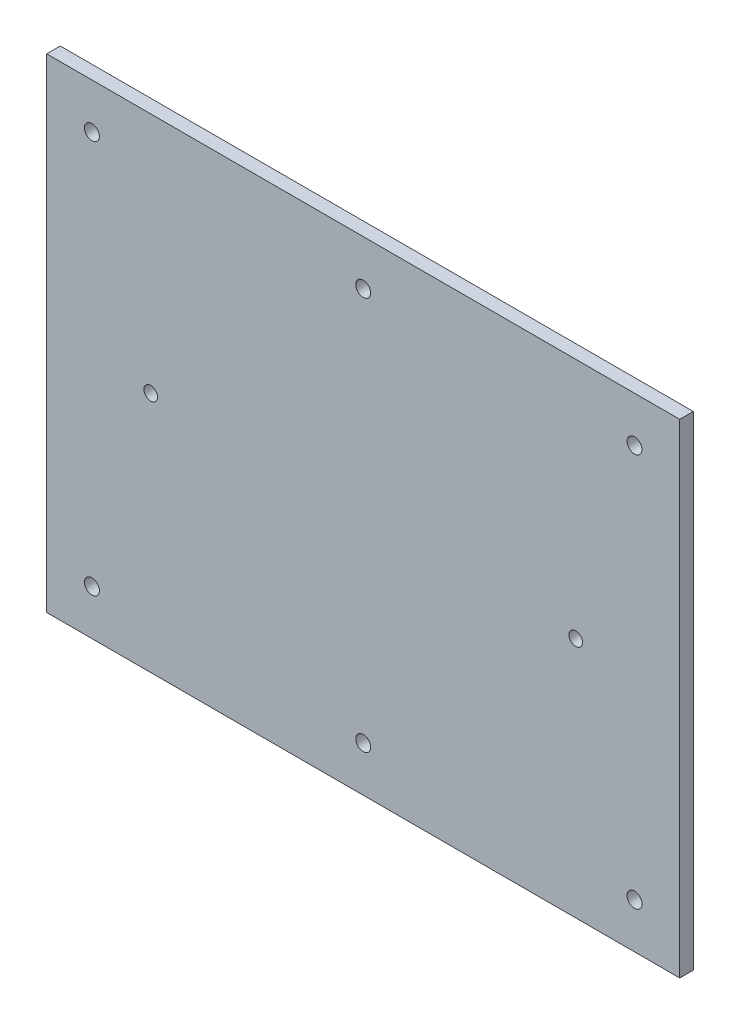
ISO-10303-21;
HEADER;
FILE_DESCRIPTION(('STEP AP214'),'2;1');
FILE_NAME('part.step','',(''),(''),'','','');
FILE_SCHEMA(('AUTOMOTIVE_DESIGN { 1 0 10303 214 1 1 1 1 }'));
ENDSEC;
DATA;
#1=APPLICATION_CONTEXT('core data for automotive mechanical design processes');
#2=APPLICATION_PROTOCOL_DEFINITION('international standard','automotive_design',2000,#1);
#3=PRODUCT_CONTEXT('',#1,'mechanical');
#4=PRODUCT('Part','Part','',(#3));
#5=PRODUCT_RELATED_PRODUCT_CATEGORY('part','',(#4));
#6=PRODUCT_DEFINITION_FORMATION('','',#4);
#7=PRODUCT_DEFINITION_CONTEXT('part definition',#1,'design');
#8=PRODUCT_DEFINITION('design','',#6,#7);
#9=PRODUCT_DEFINITION_SHAPE('','',#8);
#10=(LENGTH_UNIT() NAMED_UNIT(*) SI_UNIT(.MILLI.,.METRE.));
#11=(NAMED_UNIT(*) PLANE_ANGLE_UNIT() SI_UNIT($,.RADIAN.));
#12=(NAMED_UNIT(*) SI_UNIT($,.STERADIAN.) SOLID_ANGLE_UNIT());
#13=UNCERTAINTY_MEASURE_WITH_UNIT(LENGTH_MEASURE(1.E-05),#10,'distance_accuracy_value','');
#14=(GEOMETRIC_REPRESENTATION_CONTEXT(3) GLOBAL_UNCERTAINTY_ASSIGNED_CONTEXT((#13)) GLOBAL_UNIT_ASSIGNED_CONTEXT((#10,
#11,#12)) REPRESENTATION_CONTEXT('',''));
#15=CARTESIAN_POINT('',(0.,0.,0.));
#16=DIRECTION('',(0.,0.,1.));
#17=DIRECTION('',(1.,0.,0.));
#18=AXIS2_PLACEMENT_3D('',#15,#16,#17);
#19=CARTESIAN_POINT('',(0.,0.,3.));
#20=DIRECTION('',(0.,0.,1.));
#21=DIRECTION('',(1.,0.,0.));
#22=AXIS2_PLACEMENT_3D('',#19,#20,#21);
#23=PLANE('',#22);
#24=CARTESIAN_POINT('',(50.,77.,3.));
#25=DIRECTION('',(0.,0.,1.));
#26=DIRECTION('',(1.,0.,0.));
#27=AXIS2_PLACEMENT_3D('',#24,#25,#26);
#28=CIRCLE('',#27,1.65);
#29=CARTESIAN_POINT('',(51.65,77.,3.));
#30=VERTEX_POINT('',#29);
#31=EDGE_CURVE('E145',#30,#30,#28,.T.);
#32=ORIENTED_EDGE('',*,*,#31,.F.);
#33=EDGE_LOOP('',(#32));
#34=FACE_BOUND('',#33,.T.);
#35=CARTESIAN_POINT('',(-9.99999999999999,-10.,3.));
#36=DIRECTION('',(0.,0.,1.));
#37=DIRECTION('',(1.,0.,0.));
#38=AXIS2_PLACEMENT_3D('',#35,#36,#37);
#39=CIRCLE('',#38,1.65);
#40=CARTESIAN_POINT('',(-8.34999999999999,-10.,3.));
#41=VERTEX_POINT('',#40);
#42=EDGE_CURVE('E133',#41,#41,#39,.T.);
#43=ORIENTED_EDGE('',*,*,#42,.F.);
#44=EDGE_LOOP('',(#43));
#45=FACE_BOUND('',#44,.T.);
#46=CARTESIAN_POINT('',(110.,77.,3.));
#47=DIRECTION('',(0.,0.,1.));
#48=DIRECTION('',(1.,0.,0.));
#49=AXIS2_PLACEMENT_3D('',#46,#47,#48);
#50=CIRCLE('',#49,1.65);
#51=CARTESIAN_POINT('',(111.65,77.,3.));
#52=VERTEX_POINT('',#51);
#53=EDGE_CURVE('E121',#52,#52,#50,.T.);
#54=ORIENTED_EDGE('',*,*,#53,.F.);
#55=EDGE_LOOP('',(#54));
#56=FACE_BOUND('',#55,.T.);
#57=CARTESIAN_POINT('',(97.,33.5,3.));
#58=DIRECTION('',(0.,0.,1.));
#59=DIRECTION('',(1.,0.,0.));
#60=AXIS2_PLACEMENT_3D('',#57,#58,#59);
#61=CIRCLE('',#60,1.5);
#62=CARTESIAN_POINT('',(98.5,33.5,3.));
#63=VERTEX_POINT('',#62);
#64=EDGE_CURVE('E100',#63,#63,#61,.T.);
#65=ORIENTED_EDGE('',*,*,#64,.F.);
#66=EDGE_LOOP('',(#65));
#67=FACE_BOUND('',#66,.T.);
#68=DIRECTION('',(0.,-1.,0.));
#69=VECTOR('',#68,1.);
#70=CARTESIAN_POINT('',(-20.,87.,3.));
#71=LINE('',#70,#69);
#72=CARTESIAN_POINT('',(-20.,87.,3.));
#73=VERTEX_POINT('',#72);
#74=CARTESIAN_POINT('',(-20.,-20.,3.));
#75=VERTEX_POINT('',#74);
#76=EDGE_CURVE('E85',#73,#75,#71,.T.);
#77=ORIENTED_EDGE('',*,*,#76,.T.);
#78=DIRECTION('',(1.,0.,0.));
#79=VECTOR('',#78,1.);
#80=CARTESIAN_POINT('',(-20.,-20.,3.));
#81=LINE('',#80,#79);
#82=CARTESIAN_POINT('',(120.,-20.,3.));
#83=VERTEX_POINT('',#82);
#84=EDGE_CURVE('E80',#75,#83,#81,.T.);
#85=ORIENTED_EDGE('',*,*,#84,.T.);
#86=DIRECTION('',(0.,1.,0.));
#87=VECTOR('',#86,1.);
#88=CARTESIAN_POINT('',(120.,87.,3.));
#89=LINE('',#88,#87);
#90=CARTESIAN_POINT('',(120.,87.,3.));
#91=VERTEX_POINT('',#90);
#92=EDGE_CURVE('E83',#83,#91,#89,.T.);
#93=ORIENTED_EDGE('',*,*,#92,.T.);
#94=DIRECTION('',(-1.,0.,0.));
#95=VECTOR('',#94,1.);
#96=CARTESIAN_POINT('',(-20.,87.,3.));
#97=LINE('',#96,#95);
#98=EDGE_CURVE('E50',#91,#73,#97,.T.);
#99=ORIENTED_EDGE('',*,*,#98,.T.);
#100=EDGE_LOOP('',(#77,#85,#93,#99));
#101=FACE_BOUND('',#100,.T.);
#102=CARTESIAN_POINT('',(3.,33.5,3.));
#103=DIRECTION('',(0.,0.,1.));
#104=DIRECTION('',(1.,0.,0.));
#105=AXIS2_PLACEMENT_3D('',#102,#103,#104);
#106=CIRCLE('',#105,1.5);
#107=CARTESIAN_POINT('',(4.5,33.5,3.));
#108=VERTEX_POINT('',#107);
#109=EDGE_CURVE('E115',#108,#108,#106,.T.);
#110=ORIENTED_EDGE('',*,*,#109,.F.);
#111=EDGE_LOOP('',(#110));
#112=FACE_BOUND('',#111,.T.);
#113=CARTESIAN_POINT('',(-10.,77.,3.));
#114=DIRECTION('',(0.,0.,1.));
#115=DIRECTION('',(1.,0.,0.));
#116=AXIS2_PLACEMENT_3D('',#113,#114,#115);
#117=CIRCLE('',#116,1.65);
#118=CARTESIAN_POINT('',(-8.35,77.,3.));
#119=VERTEX_POINT('',#118);
#120=EDGE_CURVE('E127',#119,#119,#117,.T.);
#121=ORIENTED_EDGE('',*,*,#120,.F.);
#122=EDGE_LOOP('',(#121));
#123=FACE_BOUND('',#122,.T.);
#124=CARTESIAN_POINT('',(110.,-9.99999999999999,3.));
#125=DIRECTION('',(0.,0.,1.));
#126=DIRECTION('',(1.,0.,0.));
#127=AXIS2_PLACEMENT_3D('',#124,#125,#126);
#128=CIRCLE('',#127,1.65);
#129=CARTESIAN_POINT('',(111.65,-9.99999999999999,3.));
#130=VERTEX_POINT('',#129);
#131=EDGE_CURVE('E139',#130,#130,#128,.T.);
#132=ORIENTED_EDGE('',*,*,#131,.F.);
#133=EDGE_LOOP('',(#132));
#134=FACE_BOUND('',#133,.T.);
#135=CARTESIAN_POINT('',(50.,-9.99999999999999,3.));
#136=DIRECTION('',(0.,0.,1.));
#137=DIRECTION('',(1.,0.,0.));
#138=AXIS2_PLACEMENT_3D('',#135,#136,#137);
#139=CIRCLE('',#138,1.65);
#140=CARTESIAN_POINT('',(51.65,-9.99999999999999,3.));
#141=VERTEX_POINT('',#140);
#142=EDGE_CURVE('E151',#141,#141,#139,.T.);
#143=ORIENTED_EDGE('',*,*,#142,.F.);
#144=EDGE_LOOP('',(#143));
#145=FACE_BOUND('',#144,.T.);
#146=ADVANCED_FACE('F33',(#34,#45,#56,#67,#101,#112,#123,#134,#145),#23,.T.);
#147=CARTESIAN_POINT('',(0.,0.,0.));
#148=DIRECTION('',(0.,0.,1.));
#149=DIRECTION('',(1.,0.,0.));
#150=AXIS2_PLACEMENT_3D('',#147,#148,#149);
#151=PLANE('',#150);
#152=DIRECTION('',(0.,-1.,0.));
#153=VECTOR('',#152,1.);
#154=CARTESIAN_POINT('',(-20.,87.,0.));
#155=LINE('',#154,#153);
#156=CARTESIAN_POINT('',(-20.,87.,0.));
#157=VERTEX_POINT('',#156);
#158=CARTESIAN_POINT('',(-20.,-20.,0.));
#159=VERTEX_POINT('',#158);
#160=EDGE_CURVE('E97',#157,#159,#155,.T.);
#161=ORIENTED_EDGE('',*,*,#160,.F.);
#162=DIRECTION('',(-1.,0.,0.));
#163=VECTOR('',#162,1.);
#164=CARTESIAN_POINT('',(-20.,87.,0.));
#165=LINE('',#164,#163);
#166=CARTESIAN_POINT('',(120.,87.,0.));
#167=VERTEX_POINT('',#166);
#168=EDGE_CURVE('E73',#167,#157,#165,.T.);
#169=ORIENTED_EDGE('',*,*,#168,.F.);
#170=DIRECTION('',(0.,1.,0.));
#171=VECTOR('',#170,1.);
#172=CARTESIAN_POINT('',(120.,87.,0.));
#173=LINE('',#172,#171);
#174=CARTESIAN_POINT('',(120.,-20.,0.));
#175=VERTEX_POINT('',#174);
#176=EDGE_CURVE('E67',#175,#167,#173,.T.);
#177=ORIENTED_EDGE('',*,*,#176,.F.);
#178=DIRECTION('',(1.,0.,0.));
#179=VECTOR('',#178,1.);
#180=CARTESIAN_POINT('',(-20.,-20.,0.));
#181=LINE('',#180,#179);
#182=EDGE_CURVE('E89',#159,#175,#181,.T.);
#183=ORIENTED_EDGE('',*,*,#182,.F.);
#184=EDGE_LOOP('',(#161,#169,#177,#183));
#185=FACE_BOUND('',#184,.T.);
#186=CARTESIAN_POINT('',(97.,33.5,0.));
#187=DIRECTION('',(0.,0.,1.));
#188=DIRECTION('',(1.,0.,0.));
#189=AXIS2_PLACEMENT_3D('',#186,#187,#188);
#190=CIRCLE('',#189,1.5);
#191=CARTESIAN_POINT('',(98.5,33.5,0.));
#192=VERTEX_POINT('',#191);
#193=EDGE_CURVE('E112',#192,#192,#190,.T.);
#194=ORIENTED_EDGE('',*,*,#193,.T.);
#195=EDGE_LOOP('',(#194));
#196=FACE_BOUND('',#195,.T.);
#197=CARTESIAN_POINT('',(3.,33.5,0.));
#198=DIRECTION('',(0.,0.,1.));
#199=DIRECTION('',(1.,0.,0.));
#200=AXIS2_PLACEMENT_3D('',#197,#198,#199);
#201=CIRCLE('',#200,1.5);
#202=CARTESIAN_POINT('',(4.5,33.5,0.));
#203=VERTEX_POINT('',#202);
#204=EDGE_CURVE('E118',#203,#203,#201,.T.);
#205=ORIENTED_EDGE('',*,*,#204,.T.);
#206=EDGE_LOOP('',(#205));
#207=FACE_BOUND('',#206,.T.);
#208=CARTESIAN_POINT('',(110.,77.,0.));
#209=DIRECTION('',(0.,0.,1.));
#210=DIRECTION('',(1.,0.,0.));
#211=AXIS2_PLACEMENT_3D('',#208,#209,#210);
#212=CIRCLE('',#211,1.65);
#213=CARTESIAN_POINT('',(111.65,77.,0.));
#214=VERTEX_POINT('',#213);
#215=EDGE_CURVE('E124',#214,#214,#212,.T.);
#216=ORIENTED_EDGE('',*,*,#215,.T.);
#217=EDGE_LOOP('',(#216));
#218=FACE_BOUND('',#217,.T.);
#219=CARTESIAN_POINT('',(-10.,77.,0.));
#220=DIRECTION('',(0.,0.,1.));
#221=DIRECTION('',(1.,0.,0.));
#222=AXIS2_PLACEMENT_3D('',#219,#220,#221);
#223=CIRCLE('',#222,1.65);
#224=CARTESIAN_POINT('',(-8.35,77.,0.));
#225=VERTEX_POINT('',#224);
#226=EDGE_CURVE('E130',#225,#225,#223,.T.);
#227=ORIENTED_EDGE('',*,*,#226,.T.);
#228=EDGE_LOOP('',(#227));
#229=FACE_BOUND('',#228,.T.);
#230=CARTESIAN_POINT('',(-9.99999999999999,-10.,0.));
#231=DIRECTION('',(0.,0.,1.));
#232=DIRECTION('',(1.,0.,0.));
#233=AXIS2_PLACEMENT_3D('',#230,#231,#232);
#234=CIRCLE('',#233,1.65);
#235=CARTESIAN_POINT('',(-8.34999999999999,-10.,0.));
#236=VERTEX_POINT('',#235);
#237=EDGE_CURVE('E136',#236,#236,#234,.T.);
#238=ORIENTED_EDGE('',*,*,#237,.T.);
#239=EDGE_LOOP('',(#238));
#240=FACE_BOUND('',#239,.T.);
#241=CARTESIAN_POINT('',(110.,-9.99999999999999,0.));
#242=DIRECTION('',(0.,0.,1.));
#243=DIRECTION('',(1.,0.,0.));
#244=AXIS2_PLACEMENT_3D('',#241,#242,#243);
#245=CIRCLE('',#244,1.65);
#246=CARTESIAN_POINT('',(111.65,-9.99999999999999,0.));
#247=VERTEX_POINT('',#246);
#248=EDGE_CURVE('E142',#247,#247,#245,.T.);
#249=ORIENTED_EDGE('',*,*,#248,.T.);
#250=EDGE_LOOP('',(#249));
#251=FACE_BOUND('',#250,.T.);
#252=CARTESIAN_POINT('',(50.,77.,0.));
#253=DIRECTION('',(0.,0.,1.));
#254=DIRECTION('',(1.,0.,0.));
#255=AXIS2_PLACEMENT_3D('',#252,#253,#254);
#256=CIRCLE('',#255,1.65);
#257=CARTESIAN_POINT('',(51.65,77.,0.));
#258=VERTEX_POINT('',#257);
#259=EDGE_CURVE('E148',#258,#258,#256,.T.);
#260=ORIENTED_EDGE('',*,*,#259,.T.);
#261=EDGE_LOOP('',(#260));
#262=FACE_BOUND('',#261,.T.);
#263=CARTESIAN_POINT('',(50.,-9.99999999999999,0.));
#264=DIRECTION('',(0.,0.,1.));
#265=DIRECTION('',(1.,0.,0.));
#266=AXIS2_PLACEMENT_3D('',#263,#264,#265);
#267=CIRCLE('',#266,1.65);
#268=CARTESIAN_POINT('',(51.65,-9.99999999999999,0.));
#269=VERTEX_POINT('',#268);
#270=EDGE_CURVE('E154',#269,#269,#267,.T.);
#271=ORIENTED_EDGE('',*,*,#270,.T.);
#272=EDGE_LOOP('',(#271));
#273=FACE_BOUND('',#272,.T.);
#274=ADVANCED_FACE('F108',(#185,#196,#207,#218,#229,#240,#251,#262,#273),#151,.F.);
#275=CARTESIAN_POINT('',(-20.,87.,3.));
#276=DIRECTION('',(1.,0.,0.));
#277=DIRECTION('',(0.,1.,0.));
#278=AXIS2_PLACEMENT_3D('',#275,#276,#277);
#279=PLANE('',#278);
#280=ORIENTED_EDGE('',*,*,#160,.T.);
#281=DIRECTION('',(0.,0.,-1.));
#282=VECTOR('',#281,1.);
#283=CARTESIAN_POINT('',(-20.,-20.,3.));
#284=LINE('',#283,#282);
#285=EDGE_CURVE('E11',#75,#159,#284,.T.);
#286=ORIENTED_EDGE('',*,*,#285,.F.);
#287=ORIENTED_EDGE('',*,*,#76,.F.);
#288=DIRECTION('',(0.,0.,-1.));
#289=VECTOR('',#288,1.);
#290=CARTESIAN_POINT('',(-20.,87.,3.));
#291=LINE('',#290,#289);
#292=EDGE_CURVE('E93',#73,#157,#291,.T.);
#293=ORIENTED_EDGE('',*,*,#292,.T.);
#294=EDGE_LOOP('',(#280,#286,#287,#293));
#295=FACE_BOUND('',#294,.T.);
#296=ADVANCED_FACE('F35',(#295),#279,.F.);
#297=CARTESIAN_POINT('',(-20.,-20.,3.));
#298=DIRECTION('',(0.,1.,0.));
#299=DIRECTION('',(-1.,0.,0.));
#300=AXIS2_PLACEMENT_3D('',#297,#298,#299);
#301=PLANE('',#300);
#302=ORIENTED_EDGE('',*,*,#182,.T.);
#303=DIRECTION('',(0.,0.,-1.));
#304=VECTOR('',#303,1.);
#305=CARTESIAN_POINT('',(120.,-20.,3.));
#306=LINE('',#305,#304);
#307=EDGE_CURVE('E42',#83,#175,#306,.T.);
#308=ORIENTED_EDGE('',*,*,#307,.F.);
#309=ORIENTED_EDGE('',*,*,#84,.F.);
#310=ORIENTED_EDGE('',*,*,#285,.T.);
#311=EDGE_LOOP('',(#302,#308,#309,#310));
#312=FACE_BOUND('',#311,.T.);
#313=ADVANCED_FACE('F88',(#312),#301,.F.);
#314=CARTESIAN_POINT('',(120.,87.,3.));
#315=DIRECTION('',(-1.,0.,0.));
#316=DIRECTION('',(0.,-1.,0.));
#317=AXIS2_PLACEMENT_3D('',#314,#315,#316);
#318=PLANE('',#317);
#319=ORIENTED_EDGE('',*,*,#176,.T.);
#320=DIRECTION('',(0.,0.,-1.));
#321=VECTOR('',#320,1.);
#322=CARTESIAN_POINT('',(120.,87.,3.));
#323=LINE('',#322,#321);
#324=EDGE_CURVE('E90',#91,#167,#323,.T.);
#325=ORIENTED_EDGE('',*,*,#324,.F.);
#326=ORIENTED_EDGE('',*,*,#92,.F.);
#327=ORIENTED_EDGE('',*,*,#307,.T.);
#328=EDGE_LOOP('',(#319,#325,#326,#327));
#329=FACE_BOUND('',#328,.T.);
#330=ADVANCED_FACE('F91',(#329),#318,.F.);
#331=CARTESIAN_POINT('',(-20.,87.,3.));
#332=DIRECTION('',(0.,-1.,0.));
#333=DIRECTION('',(1.,0.,0.));
#334=AXIS2_PLACEMENT_3D('',#331,#332,#333);
#335=PLANE('',#334);
#336=ORIENTED_EDGE('',*,*,#168,.T.);
#337=ORIENTED_EDGE('',*,*,#292,.F.);
#338=ORIENTED_EDGE('',*,*,#98,.F.);
#339=ORIENTED_EDGE('',*,*,#324,.T.);
#340=EDGE_LOOP('',(#336,#337,#338,#339));
#341=FACE_BOUND('',#340,.T.);
#342=ADVANCED_FACE('F105',(#341),#335,.F.);
#343=CARTESIAN_POINT('',(97.,33.5,3.));
#344=DIRECTION('',(0.,0.,-1.));
#345=DIRECTION('',(-1.,0.,0.));
#346=AXIS2_PLACEMENT_3D('',#343,#344,#345);
#347=CYLINDRICAL_SURFACE('',#346,1.5);
#348=ORIENTED_EDGE('',*,*,#64,.T.);
#349=EDGE_LOOP('',(#348));
#350=FACE_BOUND('',#349,.T.);
#351=ORIENTED_EDGE('',*,*,#193,.F.);
#352=EDGE_LOOP('',(#351));
#353=FACE_BOUND('',#352,.T.);
#354=ADVANCED_FACE('F173',(#350,#353),#347,.F.);
#355=CARTESIAN_POINT('',(3.,33.5,3.));
#356=DIRECTION('',(0.,0.,-1.));
#357=DIRECTION('',(-1.,0.,0.));
#358=AXIS2_PLACEMENT_3D('',#355,#356,#357);
#359=CYLINDRICAL_SURFACE('',#358,1.5);
#360=ORIENTED_EDGE('',*,*,#109,.T.);
#361=EDGE_LOOP('',(#360));
#362=FACE_BOUND('',#361,.T.);
#363=ORIENTED_EDGE('',*,*,#204,.F.);
#364=EDGE_LOOP('',(#363));
#365=FACE_BOUND('',#364,.T.);
#366=ADVANCED_FACE('F219',(#362,#365),#359,.F.);
#367=CARTESIAN_POINT('',(110.,77.,3.));
#368=DIRECTION('',(0.,0.,-1.));
#369=DIRECTION('',(-1.,0.,0.));
#370=AXIS2_PLACEMENT_3D('',#367,#368,#369);
#371=CYLINDRICAL_SURFACE('',#370,1.65);
#372=ORIENTED_EDGE('',*,*,#53,.T.);
#373=EDGE_LOOP('',(#372));
#374=FACE_BOUND('',#373,.T.);
#375=ORIENTED_EDGE('',*,*,#215,.F.);
#376=EDGE_LOOP('',(#375));
#377=FACE_BOUND('',#376,.T.);
#378=ADVANCED_FACE('F227',(#374,#377),#371,.F.);
#379=CARTESIAN_POINT('',(-10.,77.,3.));
#380=DIRECTION('',(0.,0.,-1.));
#381=DIRECTION('',(-1.,0.,0.));
#382=AXIS2_PLACEMENT_3D('',#379,#380,#381);
#383=CYLINDRICAL_SURFACE('',#382,1.65);
#384=ORIENTED_EDGE('',*,*,#120,.T.);
#385=EDGE_LOOP('',(#384));
#386=FACE_BOUND('',#385,.T.);
#387=ORIENTED_EDGE('',*,*,#226,.F.);
#388=EDGE_LOOP('',(#387));
#389=FACE_BOUND('',#388,.T.);
#390=ADVANCED_FACE('F235',(#386,#389),#383,.F.);
#391=CARTESIAN_POINT('',(-9.99999999999999,-10.,3.));
#392=DIRECTION('',(0.,0.,-1.));
#393=DIRECTION('',(-1.,0.,0.));
#394=AXIS2_PLACEMENT_3D('',#391,#392,#393);
#395=CYLINDRICAL_SURFACE('',#394,1.65);
#396=ORIENTED_EDGE('',*,*,#42,.T.);
#397=EDGE_LOOP('',(#396));
#398=FACE_BOUND('',#397,.T.);
#399=ORIENTED_EDGE('',*,*,#237,.F.);
#400=EDGE_LOOP('',(#399));
#401=FACE_BOUND('',#400,.T.);
#402=ADVANCED_FACE('F244',(#398,#401),#395,.F.);
#403=CARTESIAN_POINT('',(110.,-9.99999999999999,3.));
#404=DIRECTION('',(0.,0.,-1.));
#405=DIRECTION('',(-1.,0.,0.));
#406=AXIS2_PLACEMENT_3D('',#403,#404,#405);
#407=CYLINDRICAL_SURFACE('',#406,1.65);
#408=ORIENTED_EDGE('',*,*,#131,.T.);
#409=EDGE_LOOP('',(#408));
#410=FACE_BOUND('',#409,.T.);
#411=ORIENTED_EDGE('',*,*,#248,.F.);
#412=EDGE_LOOP('',(#411));
#413=FACE_BOUND('',#412,.T.);
#414=ADVANCED_FACE('F253',(#410,#413),#407,.F.);
#415=CARTESIAN_POINT('',(50.,77.,3.));
#416=DIRECTION('',(0.,0.,-1.));
#417=DIRECTION('',(-1.,0.,0.));
#418=AXIS2_PLACEMENT_3D('',#415,#416,#417);
#419=CYLINDRICAL_SURFACE('',#418,1.65);
#420=ORIENTED_EDGE('',*,*,#31,.T.);
#421=EDGE_LOOP('',(#420));
#422=FACE_BOUND('',#421,.T.);
#423=ORIENTED_EDGE('',*,*,#259,.F.);
#424=EDGE_LOOP('',(#423));
#425=FACE_BOUND('',#424,.T.);
#426=ADVANCED_FACE('F262',(#422,#425),#419,.F.);
#427=CARTESIAN_POINT('',(50.,-9.99999999999999,3.));
#428=DIRECTION('',(0.,0.,-1.));
#429=DIRECTION('',(-1.,0.,0.));
#430=AXIS2_PLACEMENT_3D('',#427,#428,#429);
#431=CYLINDRICAL_SURFACE('',#430,1.65);
#432=ORIENTED_EDGE('',*,*,#142,.T.);
#433=EDGE_LOOP('',(#432));
#434=FACE_BOUND('',#433,.T.);
#435=ORIENTED_EDGE('',*,*,#270,.F.);
#436=EDGE_LOOP('',(#435));
#437=FACE_BOUND('',#436,.T.);
#438=ADVANCED_FACE('F160',(#434,#437),#431,.F.);
#439=CLOSED_SHELL('',(#146,#274,#296,#313,#330,#342,#354,#366,#378,#390,#402,#414,#426,#438));
#440=MANIFOLD_SOLID_BREP('B2',#439);
#441=ADVANCED_BREP_SHAPE_REPRESENTATION('',(#18,#440),#14);
#442=SHAPE_DEFINITION_REPRESENTATION(#9,#441);
ENDSEC;
END-ISO-10303-21;
